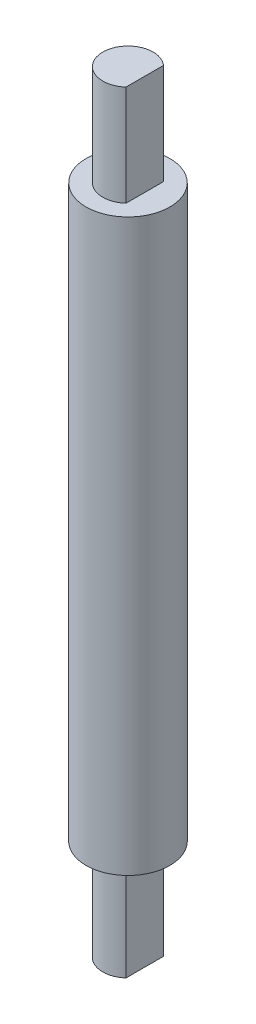
ISO-10303-21;
HEADER;
FILE_DESCRIPTION(('STEP AP214'),'2;1');
FILE_NAME('part.step','',(''),(''),'','','');
FILE_SCHEMA(('AUTOMOTIVE_DESIGN { 1 0 10303 214 1 1 1 1 }'));
ENDSEC;
DATA;
#1=APPLICATION_CONTEXT('core data for automotive mechanical design processes');
#2=APPLICATION_PROTOCOL_DEFINITION('international standard','automotive_design',2000,#1);
#3=PRODUCT_CONTEXT('',#1,'mechanical');
#4=PRODUCT('Part','Part','',(#3));
#5=PRODUCT_RELATED_PRODUCT_CATEGORY('part','',(#4));
#6=PRODUCT_DEFINITION_FORMATION('','',#4);
#7=PRODUCT_DEFINITION_CONTEXT('part definition',#1,'design');
#8=PRODUCT_DEFINITION('design','',#6,#7);
#9=PRODUCT_DEFINITION_SHAPE('','',#8);
#10=(LENGTH_UNIT() NAMED_UNIT(*) SI_UNIT(.MILLI.,.METRE.));
#11=(NAMED_UNIT(*) PLANE_ANGLE_UNIT() SI_UNIT($,.RADIAN.));
#12=(NAMED_UNIT(*) SI_UNIT($,.STERADIAN.) SOLID_ANGLE_UNIT());
#13=UNCERTAINTY_MEASURE_WITH_UNIT(LENGTH_MEASURE(1.E-05),#10,'distance_accuracy_value','');
#14=(GEOMETRIC_REPRESENTATION_CONTEXT(3) GLOBAL_UNCERTAINTY_ASSIGNED_CONTEXT((#13)) GLOBAL_UNIT_ASSIGNED_CONTEXT((#10,
#11,#12)) REPRESENTATION_CONTEXT('',''));
#15=CARTESIAN_POINT('',(0.,0.,0.));
#16=DIRECTION('',(0.,0.,1.));
#17=DIRECTION('',(1.,0.,0.));
#18=AXIS2_PLACEMENT_3D('',#15,#16,#17);
#19=CARTESIAN_POINT('',(0.,0.,0.));
#20=DIRECTION('',(0.,1.,0.));
#21=DIRECTION('',(0.,0.,1.));
#22=AXIS2_PLACEMENT_3D('',#19,#20,#21);
#23=PLANE('',#22);
#24=CARTESIAN_POINT('',(0.,0.,0.));
#25=DIRECTION('',(0.,1.,0.));
#26=DIRECTION('',(0.,0.,1.));
#27=AXIS2_PLACEMENT_3D('',#24,#25,#26);
#28=CIRCLE('',#27,2.5);
#29=CARTESIAN_POINT('',(0.,0.,2.5));
#30=VERTEX_POINT('',#29);
#31=EDGE_CURVE('E40',#30,#30,#28,.T.);
#32=ORIENTED_EDGE('',*,*,#31,.F.);
#33=EDGE_LOOP('',(#32));
#34=FACE_BOUND('',#33,.T.);
#35=CARTESIAN_POINT('',(0.,0.,0.));
#36=DIRECTION('',(0.,-1.,0.));
#37=DIRECTION('',(0.,0.,1.));
#38=AXIS2_PLACEMENT_3D('',#35,#36,#37);
#39=CIRCLE('',#38,1.5);
#40=CARTESIAN_POINT('',(1.,0.,1.11803398874989));
#41=VERTEX_POINT('',#40);
#42=CARTESIAN_POINT('',(1.,0.,-1.11803398874989));
#43=VERTEX_POINT('',#42);
#44=EDGE_CURVE('E92',#41,#43,#39,.T.);
#45=ORIENTED_EDGE('',*,*,#44,.F.);
#46=DIRECTION('',(0.,0.,1.));
#47=VECTOR('',#46,1.);
#48=CARTESIAN_POINT('',(1.,0.,-1.11803398874989));
#49=LINE('',#48,#47);
#50=EDGE_CURVE('E50',#43,#41,#49,.T.);
#51=ORIENTED_EDGE('',*,*,#50,.F.);
#52=EDGE_LOOP('',(#45,#51));
#53=FACE_BOUND('',#52,.T.);
#54=ADVANCED_FACE('F36',(#34,#53),#23,.F.);
#55=CARTESIAN_POINT('',(0.,34.,0.));
#56=DIRECTION('',(0.,-1.,0.));
#57=DIRECTION('',(0.,0.,-1.));
#58=AXIS2_PLACEMENT_3D('',#55,#56,#57);
#59=CYLINDRICAL_SURFACE('',#58,2.5);
#60=CARTESIAN_POINT('',(0.,34.,0.));
#61=DIRECTION('',(0.,1.,0.));
#62=DIRECTION('',(0.,0.,1.));
#63=AXIS2_PLACEMENT_3D('',#60,#61,#62);
#64=CIRCLE('',#63,2.5);
#65=CARTESIAN_POINT('',(0.,34.,2.5));
#66=VERTEX_POINT('',#65);
#67=EDGE_CURVE('E11',#66,#66,#64,.T.);
#68=ORIENTED_EDGE('',*,*,#67,.F.);
#69=EDGE_LOOP('',(#68));
#70=FACE_BOUND('',#69,.T.);
#71=ORIENTED_EDGE('',*,*,#31,.T.);
#72=EDGE_LOOP('',(#71));
#73=FACE_BOUND('',#72,.T.);
#74=ADVANCED_FACE('F38',(#70,#73),#59,.T.);
#75=CARTESIAN_POINT('',(0.,34.,0.));
#76=DIRECTION('',(0.,1.,0.));
#77=DIRECTION('',(0.,0.,1.));
#78=AXIS2_PLACEMENT_3D('',#75,#76,#77);
#79=PLANE('',#78);
#80=CARTESIAN_POINT('',(0.,34.,0.));
#81=DIRECTION('',(0.,1.,0.));
#82=DIRECTION('',(0.,0.,-1.));
#83=AXIS2_PLACEMENT_3D('',#80,#81,#82);
#84=CIRCLE('',#83,1.5);
#85=CARTESIAN_POINT('',(1.,34.,-1.11803398874989));
#86=VERTEX_POINT('',#85);
#87=CARTESIAN_POINT('',(1.,34.,1.11803398874989));
#88=VERTEX_POINT('',#87);
#89=EDGE_CURVE('E93',#86,#88,#84,.T.);
#90=ORIENTED_EDGE('',*,*,#89,.F.);
#91=DIRECTION('',(0.,0.,-1.));
#92=VECTOR('',#91,1.);
#93=CARTESIAN_POINT('',(1.,34.,-1.11803398874989));
#94=LINE('',#93,#92);
#95=EDGE_CURVE('E57',#88,#86,#94,.T.);
#96=ORIENTED_EDGE('',*,*,#95,.F.);
#97=EDGE_LOOP('',(#90,#96));
#98=FACE_BOUND('',#97,.T.);
#99=ORIENTED_EDGE('',*,*,#67,.T.);
#100=EDGE_LOOP('',(#99));
#101=FACE_BOUND('',#100,.T.);
#102=ADVANCED_FACE('F121',(#98,#101),#79,.T.);
#103=CARTESIAN_POINT('',(0.,40.,0.));
#104=DIRECTION('',(0.,-1.,0.));
#105=DIRECTION('',(0.,0.,-1.));
#106=AXIS2_PLACEMENT_3D('',#103,#104,#105);
#107=CYLINDRICAL_SURFACE('',#106,1.5);
#108=ORIENTED_EDGE('',*,*,#89,.T.);
#109=DIRECTION('',(0.,-1.,0.));
#110=VECTOR('',#109,1.);
#111=CARTESIAN_POINT('',(1.,40.,1.11803398874989));
#112=LINE('',#111,#110);
#113=CARTESIAN_POINT('',(1.,40.,1.11803398874989));
#114=VERTEX_POINT('',#113);
#115=EDGE_CURVE('E109',#114,#88,#112,.T.);
#116=ORIENTED_EDGE('',*,*,#115,.F.);
#117=CARTESIAN_POINT('',(0.,40.,0.));
#118=DIRECTION('',(0.,1.,0.));
#119=DIRECTION('',(0.,0.,-1.));
#120=AXIS2_PLACEMENT_3D('',#117,#118,#119);
#121=CIRCLE('',#120,1.5);
#122=CARTESIAN_POINT('',(1.,40.,-1.11803398874989));
#123=VERTEX_POINT('',#122);
#124=EDGE_CURVE('E100',#123,#114,#121,.T.);
#125=ORIENTED_EDGE('',*,*,#124,.F.);
#126=DIRECTION('',(0.,-1.,0.));
#127=VECTOR('',#126,1.);
#128=CARTESIAN_POINT('',(1.,40.,-1.11803398874989));
#129=LINE('',#128,#127);
#130=EDGE_CURVE('E104',#123,#86,#129,.T.);
#131=ORIENTED_EDGE('',*,*,#130,.T.);
#132=EDGE_LOOP('',(#108,#116,#125,#131));
#133=FACE_BOUND('',#132,.T.);
#134=ADVANCED_FACE('F126',(#133),#107,.T.);
#135=CARTESIAN_POINT('',(1.,40.,-1.11803398874989));
#136=DIRECTION('',(-1.,0.,0.));
#137=DIRECTION('',(0.,0.,1.));
#138=AXIS2_PLACEMENT_3D('',#135,#136,#137);
#139=PLANE('',#138);
#140=ORIENTED_EDGE('',*,*,#95,.T.);
#141=ORIENTED_EDGE('',*,*,#130,.F.);
#142=DIRECTION('',(0.,0.,-1.));
#143=VECTOR('',#142,1.);
#144=CARTESIAN_POINT('',(1.,40.,-1.11803398874989));
#145=LINE('',#144,#143);
#146=EDGE_CURVE('E103',#114,#123,#145,.T.);
#147=ORIENTED_EDGE('',*,*,#146,.F.);
#148=ORIENTED_EDGE('',*,*,#115,.T.);
#149=EDGE_LOOP('',(#140,#141,#147,#148));
#150=FACE_BOUND('',#149,.T.);
#151=ADVANCED_FACE('F129',(#150),#139,.F.);
#152=CARTESIAN_POINT('',(0.,40.,0.));
#153=DIRECTION('',(0.,-1.,0.));
#154=DIRECTION('',(0.,0.,-1.));
#155=AXIS2_PLACEMENT_3D('',#152,#153,#154);
#156=PLANE('',#155);
#157=ORIENTED_EDGE('',*,*,#124,.T.);
#158=ORIENTED_EDGE('',*,*,#146,.T.);
#159=EDGE_LOOP('',(#157,#158));
#160=FACE_BOUND('',#159,.T.);
#161=ADVANCED_FACE('F133',(#160),#156,.F.);
#162=CARTESIAN_POINT('',(0.,-6.,0.));
#163=DIRECTION('',(0.,1.,0.));
#164=DIRECTION('',(0.,0.,1.));
#165=AXIS2_PLACEMENT_3D('',#162,#163,#164);
#166=CYLINDRICAL_SURFACE('',#165,1.5);
#167=ORIENTED_EDGE('',*,*,#44,.T.);
#168=DIRECTION('',(0.,1.,0.));
#169=VECTOR('',#168,1.);
#170=CARTESIAN_POINT('',(1.,-6.,-1.11803398874989));
#171=LINE('',#170,#169);
#172=CARTESIAN_POINT('',(1.,-6.,-1.11803398874989));
#173=VERTEX_POINT('',#172);
#174=EDGE_CURVE('E80',#173,#43,#171,.T.);
#175=ORIENTED_EDGE('',*,*,#174,.F.);
#176=CARTESIAN_POINT('',(0.,-6.,0.));
#177=DIRECTION('',(0.,-1.,0.));
#178=DIRECTION('',(0.,0.,1.));
#179=AXIS2_PLACEMENT_3D('',#176,#177,#178);
#180=CIRCLE('',#179,1.5);
#181=CARTESIAN_POINT('',(1.,-6.,1.11803398874989));
#182=VERTEX_POINT('',#181);
#183=EDGE_CURVE('E86',#182,#173,#180,.T.);
#184=ORIENTED_EDGE('',*,*,#183,.F.);
#185=DIRECTION('',(0.,1.,0.));
#186=VECTOR('',#185,1.);
#187=CARTESIAN_POINT('',(1.,-6.,1.11803398874989));
#188=LINE('',#187,#186);
#189=EDGE_CURVE('E83',#182,#41,#188,.T.);
#190=ORIENTED_EDGE('',*,*,#189,.T.);
#191=EDGE_LOOP('',(#167,#175,#184,#190));
#192=FACE_BOUND('',#191,.T.);
#193=ADVANCED_FACE('F91',(#192),#166,.T.);
#194=CARTESIAN_POINT('',(1.,-6.,-1.11803398874989));
#195=DIRECTION('',(-1.,0.,0.));
#196=DIRECTION('',(0.,0.,1.));
#197=AXIS2_PLACEMENT_3D('',#194,#195,#196);
#198=PLANE('',#197);
#199=ORIENTED_EDGE('',*,*,#50,.T.);
#200=ORIENTED_EDGE('',*,*,#189,.F.);
#201=DIRECTION('',(0.,0.,1.));
#202=VECTOR('',#201,1.);
#203=CARTESIAN_POINT('',(1.,-6.,-1.11803398874989));
#204=LINE('',#203,#202);
#205=EDGE_CURVE('E76',#173,#182,#204,.T.);
#206=ORIENTED_EDGE('',*,*,#205,.F.);
#207=ORIENTED_EDGE('',*,*,#174,.T.);
#208=EDGE_LOOP('',(#199,#200,#206,#207));
#209=FACE_BOUND('',#208,.T.);
#210=ADVANCED_FACE('F78',(#209),#198,.F.);
#211=CARTESIAN_POINT('',(0.,-6.,0.));
#212=DIRECTION('',(0.,1.,0.));
#213=DIRECTION('',(0.,0.,1.));
#214=AXIS2_PLACEMENT_3D('',#211,#212,#213);
#215=PLANE('',#214);
#216=ORIENTED_EDGE('',*,*,#183,.T.);
#217=ORIENTED_EDGE('',*,*,#205,.T.);
#218=EDGE_LOOP('',(#216,#217));
#219=FACE_BOUND('',#218,.T.);
#220=ADVANCED_FACE('F88',(#219),#215,.F.);
#221=CLOSED_SHELL('',(#54,#74,#102,#134,#151,#161,#193,#210,#220));
#222=MANIFOLD_SOLID_BREP('B2',#221);
#223=ADVANCED_BREP_SHAPE_REPRESENTATION('',(#18,#222),#14);
#224=SHAPE_DEFINITION_REPRESENTATION(#9,#223);
ENDSEC;
END-ISO-10303-21;
